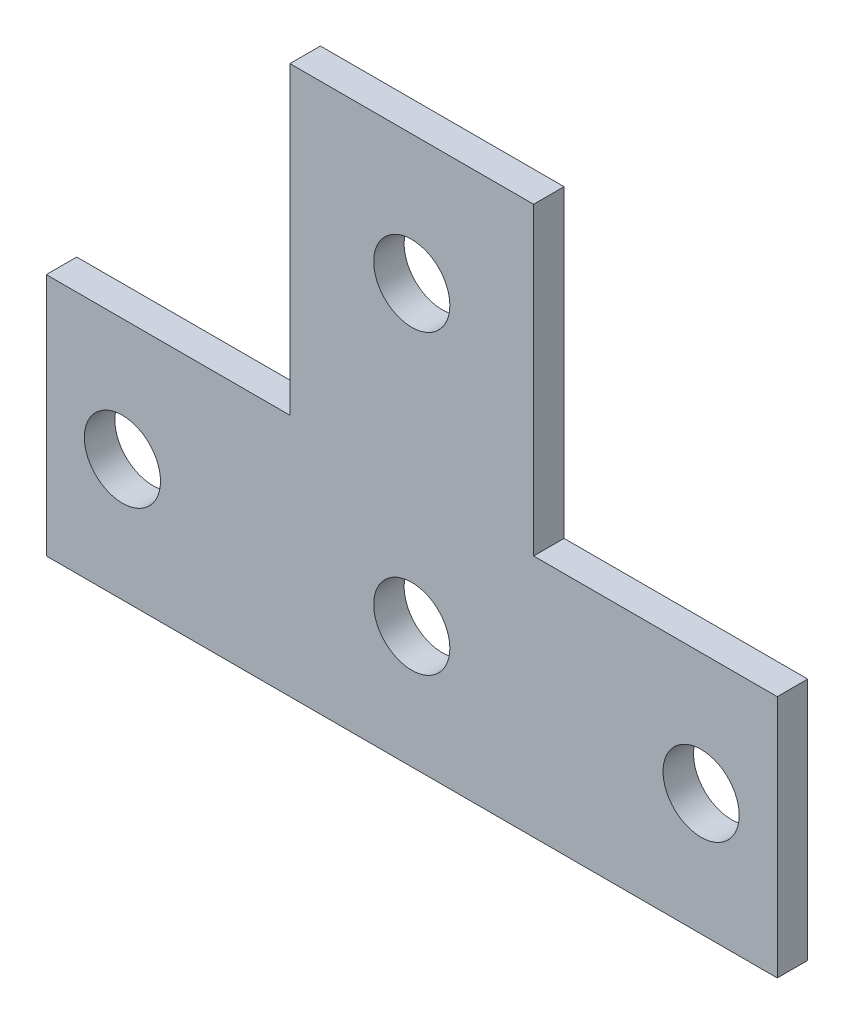
ISO-10303-21;
HEADER;
FILE_DESCRIPTION(('STEP AP214'),'2;1');
FILE_NAME('part.step','',(''),(''),'','','');
FILE_SCHEMA(('AUTOMOTIVE_DESIGN { 1 0 10303 214 1 1 1 1 }'));
ENDSEC;
DATA;
#1=APPLICATION_CONTEXT('core data for automotive mechanical design processes');
#2=APPLICATION_PROTOCOL_DEFINITION('international standard','automotive_design',2000,#1);
#3=PRODUCT_CONTEXT('',#1,'mechanical');
#4=PRODUCT('Part','Part','',(#3));
#5=PRODUCT_RELATED_PRODUCT_CATEGORY('part','',(#4));
#6=PRODUCT_DEFINITION_FORMATION('','',#4);
#7=PRODUCT_DEFINITION_CONTEXT('part definition',#1,'design');
#8=PRODUCT_DEFINITION('design','',#6,#7);
#9=PRODUCT_DEFINITION_SHAPE('','',#8);
#10=(LENGTH_UNIT() NAMED_UNIT(*) SI_UNIT(.MILLI.,.METRE.));
#11=(NAMED_UNIT(*) PLANE_ANGLE_UNIT() SI_UNIT($,.RADIAN.));
#12=(NAMED_UNIT(*) SI_UNIT($,.STERADIAN.) SOLID_ANGLE_UNIT());
#13=UNCERTAINTY_MEASURE_WITH_UNIT(LENGTH_MEASURE(1.E-05),#10,'distance_accuracy_value','');
#14=(GEOMETRIC_REPRESENTATION_CONTEXT(3) GLOBAL_UNCERTAINTY_ASSIGNED_CONTEXT((#13)) GLOBAL_UNIT_ASSIGNED_CONTEXT((#10,
#11,#12)) REPRESENTATION_CONTEXT('',''));
#15=CARTESIAN_POINT('',(0.,0.,0.));
#16=DIRECTION('',(0.,0.,1.));
#17=DIRECTION('',(1.,0.,0.));
#18=AXIS2_PLACEMENT_3D('',#15,#16,#17);
#19=CARTESIAN_POINT('',(0.,0.,2.));
#20=DIRECTION('',(0.,0.,1.));
#21=DIRECTION('',(1.,0.,0.));
#22=AXIS2_PLACEMENT_3D('',#19,#20,#21);
#23=PLANE('',#22);
#24=DIRECTION('',(1.,0.,0.));
#25=VECTOR('',#24,1.);
#26=CARTESIAN_POINT('',(-8.,20.,2.));
#27=LINE('',#26,#25);
#28=CARTESIAN_POINT('',(-8.,20.,2.));
#29=VERTEX_POINT('',#28);
#30=CARTESIAN_POINT('',(8.,20.,2.));
#31=VERTEX_POINT('',#30);
#32=EDGE_CURVE('E196',#29,#31,#27,.T.);
#33=ORIENTED_EDGE('',*,*,#32,.F.);
#34=DIRECTION('',(0.,-1.,0.));
#35=VECTOR('',#34,1.);
#36=CARTESIAN_POINT('',(-7.99999999999999,0.,2.));
#37=LINE('',#36,#35);
#38=CARTESIAN_POINT('',(-7.99999999999999,0.,2.));
#39=VERTEX_POINT('',#38);
#40=EDGE_CURVE('E67',#29,#39,#37,.T.);
#41=ORIENTED_EDGE('',*,*,#40,.T.);
#42=DIRECTION('',(-1.,0.,0.));
#43=VECTOR('',#42,1.);
#44=CARTESIAN_POINT('',(-24.,0.,2.));
#45=LINE('',#44,#43);
#46=CARTESIAN_POINT('',(-24.,0.,2.));
#47=VERTEX_POINT('',#46);
#48=EDGE_CURVE('E173',#39,#47,#45,.T.);
#49=ORIENTED_EDGE('',*,*,#48,.T.);
#50=DIRECTION('',(0.,-1.,0.));
#51=VECTOR('',#50,1.);
#52=CARTESIAN_POINT('',(-24.,-16.,2.));
#53=LINE('',#52,#51);
#54=CARTESIAN_POINT('',(-24.,-16.,2.));
#55=VERTEX_POINT('',#54);
#56=EDGE_CURVE('E102',#47,#55,#53,.T.);
#57=ORIENTED_EDGE('',*,*,#56,.T.);
#58=DIRECTION('',(1.,0.,0.));
#59=VECTOR('',#58,1.);
#60=CARTESIAN_POINT('',(24.,-16.,2.));
#61=LINE('',#60,#59);
#62=CARTESIAN_POINT('',(24.,-16.,2.));
#63=VERTEX_POINT('',#62);
#64=EDGE_CURVE('E120',#55,#63,#61,.T.);
#65=ORIENTED_EDGE('',*,*,#64,.T.);
#66=DIRECTION('',(0.,1.,0.));
#67=VECTOR('',#66,1.);
#68=CARTESIAN_POINT('',(24.,0.,2.));
#69=LINE('',#68,#67);
#70=CARTESIAN_POINT('',(24.,0.,2.));
#71=VERTEX_POINT('',#70);
#72=EDGE_CURVE('E112',#63,#71,#69,.T.);
#73=ORIENTED_EDGE('',*,*,#72,.T.);
#74=DIRECTION('',(-1.,0.,0.));
#75=VECTOR('',#74,1.);
#76=CARTESIAN_POINT('',(8.,0.,2.));
#77=LINE('',#76,#75);
#78=CARTESIAN_POINT('',(8.,0.,2.));
#79=VERTEX_POINT('',#78);
#80=EDGE_CURVE('E117',#71,#79,#77,.T.);
#81=ORIENTED_EDGE('',*,*,#80,.T.);
#82=DIRECTION('',(0.,1.,0.));
#83=VECTOR('',#82,1.);
#84=CARTESIAN_POINT('',(8.,54.,2.));
#85=LINE('',#84,#83);
#86=EDGE_CURVE('E141',#79,#31,#85,.T.);
#87=ORIENTED_EDGE('',*,*,#86,.T.);
#88=EDGE_LOOP('',(#33,#41,#49,#57,#65,#73,#81,#87));
#89=FACE_BOUND('',#88,.T.);
#90=CARTESIAN_POINT('',(0.,-8.,2.));
#91=DIRECTION('',(0.,0.,1.));
#92=DIRECTION('',(1.,0.,0.));
#93=AXIS2_PLACEMENT_3D('',#90,#91,#92);
#94=CIRCLE('',#93,2.5);
#95=CARTESIAN_POINT('',(2.50000000000001,-8.,2.));
#96=VERTEX_POINT('',#95);
#97=EDGE_CURVE('E225',#96,#96,#94,.T.);
#98=ORIENTED_EDGE('',*,*,#97,.F.);
#99=EDGE_LOOP('',(#98));
#100=FACE_BOUND('',#99,.T.);
#101=CARTESIAN_POINT('',(19.,-7.99999999999999,2.));
#102=DIRECTION('',(0.,0.,1.));
#103=DIRECTION('',(1.,0.,0.));
#104=AXIS2_PLACEMENT_3D('',#101,#102,#103);
#105=CIRCLE('',#104,2.5);
#106=CARTESIAN_POINT('',(21.5,-7.99999999999999,2.));
#107=VERTEX_POINT('',#106);
#108=EDGE_CURVE('E156',#107,#107,#105,.T.);
#109=ORIENTED_EDGE('',*,*,#108,.F.);
#110=EDGE_LOOP('',(#109));
#111=FACE_BOUND('',#110,.T.);
#112=CARTESIAN_POINT('',(-19.,-8.,2.));
#113=DIRECTION('',(0.,0.,1.));
#114=DIRECTION('',(1.,0.,0.));
#115=AXIS2_PLACEMENT_3D('',#112,#113,#114);
#116=CIRCLE('',#115,2.5);
#117=CARTESIAN_POINT('',(-16.5,-8.,2.));
#118=VERTEX_POINT('',#117);
#119=EDGE_CURVE('E217',#118,#118,#116,.T.);
#120=ORIENTED_EDGE('',*,*,#119,.F.);
#121=EDGE_LOOP('',(#120));
#122=FACE_BOUND('',#121,.T.);
#123=CARTESIAN_POINT('',(0.,11.5,2.));
#124=DIRECTION('',(0.,0.,1.));
#125=DIRECTION('',(1.,0.,0.));
#126=AXIS2_PLACEMENT_3D('',#123,#124,#125);
#127=CIRCLE('',#126,2.5);
#128=CARTESIAN_POINT('',(2.50000000000001,11.5,2.));
#129=VERTEX_POINT('',#128);
#130=EDGE_CURVE('E209',#129,#129,#127,.T.);
#131=ORIENTED_EDGE('',*,*,#130,.F.);
#132=EDGE_LOOP('',(#131));
#133=FACE_BOUND('',#132,.T.);
#134=ADVANCED_FACE('F42',(#89,#100,#111,#122,#133),#23,.T.);
#135=CARTESIAN_POINT('',(0.,0.,0.));
#136=DIRECTION('',(0.,0.,1.));
#137=DIRECTION('',(1.,0.,0.));
#138=AXIS2_PLACEMENT_3D('',#135,#136,#137);
#139=PLANE('',#138);
#140=DIRECTION('',(0.,-1.,0.));
#141=VECTOR('',#140,1.);
#142=CARTESIAN_POINT('',(-7.99999999999999,0.,0.));
#143=LINE('',#142,#141);
#144=CARTESIAN_POINT('',(-7.99999999999999,20.,0.));
#145=VERTEX_POINT('',#144);
#146=CARTESIAN_POINT('',(-7.99999999999999,0.,0.));
#147=VERTEX_POINT('',#146);
#148=EDGE_CURVE('E94',#145,#147,#143,.T.);
#149=ORIENTED_EDGE('',*,*,#148,.F.);
#150=DIRECTION('',(1.,0.,0.));
#151=VECTOR('',#150,1.);
#152=CARTESIAN_POINT('',(-8.,20.,0.));
#153=LINE('',#152,#151);
#154=CARTESIAN_POINT('',(8.,20.,0.));
#155=VERTEX_POINT('',#154);
#156=EDGE_CURVE('E58',#145,#155,#153,.T.);
#157=ORIENTED_EDGE('',*,*,#156,.T.);
#158=DIRECTION('',(0.,1.,0.));
#159=VECTOR('',#158,1.);
#160=CARTESIAN_POINT('',(8.,54.,0.));
#161=LINE('',#160,#159);
#162=CARTESIAN_POINT('',(8.,0.,0.));
#163=VERTEX_POINT('',#162);
#164=EDGE_CURVE('E167',#163,#155,#161,.T.);
#165=ORIENTED_EDGE('',*,*,#164,.F.);
#166=DIRECTION('',(-1.,0.,0.));
#167=VECTOR('',#166,1.);
#168=CARTESIAN_POINT('',(8.,0.,0.));
#169=LINE('',#168,#167);
#170=CARTESIAN_POINT('',(24.,0.,0.));
#171=VERTEX_POINT('',#170);
#172=EDGE_CURVE('E164',#171,#163,#169,.T.);
#173=ORIENTED_EDGE('',*,*,#172,.F.);
#174=DIRECTION('',(0.,1.,0.));
#175=VECTOR('',#174,1.);
#176=CARTESIAN_POINT('',(24.,0.,0.));
#177=LINE('',#176,#175);
#178=CARTESIAN_POINT('',(24.,-16.,0.));
#179=VERTEX_POINT('',#178);
#180=EDGE_CURVE('E130',#179,#171,#177,.T.);
#181=ORIENTED_EDGE('',*,*,#180,.F.);
#182=DIRECTION('',(1.,0.,0.));
#183=VECTOR('',#182,1.);
#184=CARTESIAN_POINT('',(24.,-16.,0.));
#185=LINE('',#184,#183);
#186=CARTESIAN_POINT('',(-24.,-16.,0.));
#187=VERTEX_POINT('',#186);
#188=EDGE_CURVE('E159',#187,#179,#185,.T.);
#189=ORIENTED_EDGE('',*,*,#188,.F.);
#190=DIRECTION('',(0.,-1.,0.));
#191=VECTOR('',#190,1.);
#192=CARTESIAN_POINT('',(-24.,-16.,0.));
#193=LINE('',#192,#191);
#194=CARTESIAN_POINT('',(-24.,0.,0.));
#195=VERTEX_POINT('',#194);
#196=EDGE_CURVE('E155',#195,#187,#193,.T.);
#197=ORIENTED_EDGE('',*,*,#196,.F.);
#198=DIRECTION('',(-1.,0.,0.));
#199=VECTOR('',#198,1.);
#200=CARTESIAN_POINT('',(-24.,0.,0.));
#201=LINE('',#200,#199);
#202=EDGE_CURVE('E151',#147,#195,#201,.T.);
#203=ORIENTED_EDGE('',*,*,#202,.F.);
#204=EDGE_LOOP('',(#149,#157,#165,#173,#181,#189,#197,#203));
#205=FACE_BOUND('',#204,.T.);
#206=CARTESIAN_POINT('',(19.,-7.99999999999999,0.));
#207=DIRECTION('',(0.,0.,1.));
#208=DIRECTION('',(1.,0.,0.));
#209=AXIS2_PLACEMENT_3D('',#206,#207,#208);
#210=CIRCLE('',#209,2.5);
#211=CARTESIAN_POINT('',(21.5,-7.99999999999999,0.));
#212=VERTEX_POINT('',#211);
#213=EDGE_CURVE('E229',#212,#212,#210,.T.);
#214=ORIENTED_EDGE('',*,*,#213,.T.);
#215=EDGE_LOOP('',(#214));
#216=FACE_BOUND('',#215,.T.);
#217=CARTESIAN_POINT('',(0.,-8.,0.));
#218=DIRECTION('',(0.,0.,1.));
#219=DIRECTION('',(1.,0.,0.));
#220=AXIS2_PLACEMENT_3D('',#217,#218,#219);
#221=CIRCLE('',#220,2.5);
#222=CARTESIAN_POINT('',(2.50000000000001,-8.,0.));
#223=VERTEX_POINT('',#222);
#224=EDGE_CURVE('E221',#223,#223,#221,.T.);
#225=ORIENTED_EDGE('',*,*,#224,.T.);
#226=EDGE_LOOP('',(#225));
#227=FACE_BOUND('',#226,.T.);
#228=CARTESIAN_POINT('',(-19.,-8.,0.));
#229=DIRECTION('',(0.,0.,1.));
#230=DIRECTION('',(1.,0.,0.));
#231=AXIS2_PLACEMENT_3D('',#228,#229,#230);
#232=CIRCLE('',#231,2.5);
#233=CARTESIAN_POINT('',(-16.5,-8.,0.));
#234=VERTEX_POINT('',#233);
#235=EDGE_CURVE('E213',#234,#234,#232,.T.);
#236=ORIENTED_EDGE('',*,*,#235,.T.);
#237=EDGE_LOOP('',(#236));
#238=FACE_BOUND('',#237,.T.);
#239=CARTESIAN_POINT('',(0.,11.5,0.));
#240=DIRECTION('',(0.,0.,1.));
#241=DIRECTION('',(1.,0.,0.));
#242=AXIS2_PLACEMENT_3D('',#239,#240,#241);
#243=CIRCLE('',#242,2.5);
#244=CARTESIAN_POINT('',(2.50000000000001,11.5,0.));
#245=VERTEX_POINT('',#244);
#246=EDGE_CURVE('E204',#245,#245,#243,.T.);
#247=ORIENTED_EDGE('',*,*,#246,.T.);
#248=EDGE_LOOP('',(#247));
#249=FACE_BOUND('',#248,.T.);
#250=ADVANCED_FACE('F186',(#205,#216,#227,#238,#249),#139,.F.);
#251=CARTESIAN_POINT('',(-24.,0.,2.));
#252=DIRECTION('',(0.,-1.,0.));
#253=DIRECTION('',(0.,0.,-1.));
#254=AXIS2_PLACEMENT_3D('',#251,#252,#253);
#255=PLANE('',#254);
#256=ORIENTED_EDGE('',*,*,#202,.T.);
#257=DIRECTION('',(0.,0.,-1.));
#258=VECTOR('',#257,1.);
#259=CARTESIAN_POINT('',(-24.,0.,2.));
#260=LINE('',#259,#258);
#261=EDGE_CURVE('E11',#47,#195,#260,.T.);
#262=ORIENTED_EDGE('',*,*,#261,.F.);
#263=ORIENTED_EDGE('',*,*,#48,.F.);
#264=DIRECTION('',(0.,0.,-1.));
#265=VECTOR('',#264,1.);
#266=CARTESIAN_POINT('',(-7.99999999999999,0.,2.));
#267=LINE('',#266,#265);
#268=EDGE_CURVE('E150',#39,#147,#267,.T.);
#269=ORIENTED_EDGE('',*,*,#268,.T.);
#270=EDGE_LOOP('',(#256,#262,#263,#269));
#271=FACE_BOUND('',#270,.T.);
#272=ADVANCED_FACE('F44',(#271),#255,.F.);
#273=CARTESIAN_POINT('',(-24.,-16.,2.));
#274=DIRECTION('',(1.,0.,0.));
#275=DIRECTION('',(0.,0.,-1.));
#276=AXIS2_PLACEMENT_3D('',#273,#274,#275);
#277=PLANE('',#276);
#278=ORIENTED_EDGE('',*,*,#196,.T.);
#279=DIRECTION('',(0.,0.,-1.));
#280=VECTOR('',#279,1.);
#281=CARTESIAN_POINT('',(-24.,-16.,2.));
#282=LINE('',#281,#280);
#283=EDGE_CURVE('E51',#55,#187,#282,.T.);
#284=ORIENTED_EDGE('',*,*,#283,.F.);
#285=ORIENTED_EDGE('',*,*,#56,.F.);
#286=ORIENTED_EDGE('',*,*,#261,.T.);
#287=EDGE_LOOP('',(#278,#284,#285,#286));
#288=FACE_BOUND('',#287,.T.);
#289=ADVANCED_FACE('F272',(#288),#277,.F.);
#290=CARTESIAN_POINT('',(24.,-16.,2.));
#291=DIRECTION('',(0.,1.,0.));
#292=DIRECTION('',(-1.,0.,0.));
#293=AXIS2_PLACEMENT_3D('',#290,#291,#292);
#294=PLANE('',#293);
#295=ORIENTED_EDGE('',*,*,#188,.T.);
#296=DIRECTION('',(0.,0.,-1.));
#297=VECTOR('',#296,1.);
#298=CARTESIAN_POINT('',(24.,-16.,2.));
#299=LINE('',#298,#297);
#300=EDGE_CURVE('E134',#63,#179,#299,.T.);
#301=ORIENTED_EDGE('',*,*,#300,.F.);
#302=ORIENTED_EDGE('',*,*,#64,.F.);
#303=ORIENTED_EDGE('',*,*,#283,.T.);
#304=EDGE_LOOP('',(#295,#301,#302,#303));
#305=FACE_BOUND('',#304,.T.);
#306=ADVANCED_FACE('F184',(#305),#294,.F.);
#307=CARTESIAN_POINT('',(24.,0.,2.));
#308=DIRECTION('',(-1.,0.,0.));
#309=DIRECTION('',(0.,-1.,0.));
#310=AXIS2_PLACEMENT_3D('',#307,#308,#309);
#311=PLANE('',#310);
#312=ORIENTED_EDGE('',*,*,#180,.T.);
#313=DIRECTION('',(0.,0.,-1.));
#314=VECTOR('',#313,1.);
#315=CARTESIAN_POINT('',(24.,0.,2.));
#316=LINE('',#315,#314);
#317=EDGE_CURVE('E127',#71,#171,#316,.T.);
#318=ORIENTED_EDGE('',*,*,#317,.F.);
#319=ORIENTED_EDGE('',*,*,#72,.F.);
#320=ORIENTED_EDGE('',*,*,#300,.T.);
#321=EDGE_LOOP('',(#312,#318,#319,#320));
#322=FACE_BOUND('',#321,.T.);
#323=ADVANCED_FACE('F128',(#322),#311,.F.);
#324=CARTESIAN_POINT('',(8.,0.,2.));
#325=DIRECTION('',(0.,-1.,0.));
#326=DIRECTION('',(1.,0.,0.));
#327=AXIS2_PLACEMENT_3D('',#324,#325,#326);
#328=PLANE('',#327);
#329=ORIENTED_EDGE('',*,*,#172,.T.);
#330=DIRECTION('',(0.,0.,-1.));
#331=VECTOR('',#330,1.);
#332=CARTESIAN_POINT('',(8.,0.,2.));
#333=LINE('',#332,#331);
#334=EDGE_CURVE('E135',#79,#163,#333,.T.);
#335=ORIENTED_EDGE('',*,*,#334,.F.);
#336=ORIENTED_EDGE('',*,*,#80,.F.);
#337=ORIENTED_EDGE('',*,*,#317,.T.);
#338=EDGE_LOOP('',(#329,#335,#336,#337));
#339=FACE_BOUND('',#338,.T.);
#340=ADVANCED_FACE('F137',(#339),#328,.F.);
#341=CARTESIAN_POINT('',(8.,54.,2.));
#342=DIRECTION('',(-1.,0.,0.));
#343=DIRECTION('',(0.,-1.,0.));
#344=AXIS2_PLACEMENT_3D('',#341,#342,#343);
#345=PLANE('',#344);
#346=ORIENTED_EDGE('',*,*,#164,.T.);
#347=DIRECTION('',(0.,0.,1.));
#348=VECTOR('',#347,1.);
#349=CARTESIAN_POINT('',(8.,20.,0.));
#350=LINE('',#349,#348);
#351=EDGE_CURVE('E193',#155,#31,#350,.T.);
#352=ORIENTED_EDGE('',*,*,#351,.T.);
#353=ORIENTED_EDGE('',*,*,#86,.F.);
#354=ORIENTED_EDGE('',*,*,#334,.T.);
#355=EDGE_LOOP('',(#346,#352,#353,#354));
#356=FACE_BOUND('',#355,.T.);
#357=ADVANCED_FACE('F191',(#356),#345,.F.);
#358=CARTESIAN_POINT('',(-7.99999999999999,0.,2.));
#359=DIRECTION('',(1.,0.,0.));
#360=DIRECTION('',(0.,1.,0.));
#361=AXIS2_PLACEMENT_3D('',#358,#359,#360);
#362=PLANE('',#361);
#363=ORIENTED_EDGE('',*,*,#40,.F.);
#364=DIRECTION('',(0.,0.,1.));
#365=VECTOR('',#364,1.);
#366=CARTESIAN_POINT('',(-8.,20.,0.));
#367=LINE('',#366,#365);
#368=EDGE_CURVE('E198',#145,#29,#367,.T.);
#369=ORIENTED_EDGE('',*,*,#368,.F.);
#370=ORIENTED_EDGE('',*,*,#148,.T.);
#371=ORIENTED_EDGE('',*,*,#268,.F.);
#372=EDGE_LOOP('',(#363,#369,#370,#371));
#373=FACE_BOUND('',#372,.T.);
#374=ADVANCED_FACE('F289',(#373),#362,.F.);
#375=CARTESIAN_POINT('',(19.,-7.99999999999999,2.));
#376=DIRECTION('',(0.,0.,-1.));
#377=DIRECTION('',(-1.,0.,0.));
#378=AXIS2_PLACEMENT_3D('',#375,#376,#377);
#379=CYLINDRICAL_SURFACE('',#378,2.5);
#380=ORIENTED_EDGE('',*,*,#108,.T.);
#381=EDGE_LOOP('',(#380));
#382=FACE_BOUND('',#381,.T.);
#383=ORIENTED_EDGE('',*,*,#213,.F.);
#384=EDGE_LOOP('',(#383));
#385=FACE_BOUND('',#384,.T.);
#386=ADVANCED_FACE('F286',(#382,#385),#379,.F.);
#387=CARTESIAN_POINT('',(0.,-8.,2.));
#388=DIRECTION('',(0.,0.,-1.));
#389=DIRECTION('',(-1.,0.,0.));
#390=AXIS2_PLACEMENT_3D('',#387,#388,#389);
#391=CYLINDRICAL_SURFACE('',#390,2.5);
#392=ORIENTED_EDGE('',*,*,#97,.T.);
#393=EDGE_LOOP('',(#392));
#394=FACE_BOUND('',#393,.T.);
#395=ORIENTED_EDGE('',*,*,#224,.F.);
#396=EDGE_LOOP('',(#395));
#397=FACE_BOUND('',#396,.T.);
#398=ADVANCED_FACE('F319',(#394,#397),#391,.F.);
#399=CARTESIAN_POINT('',(-19.,-8.,2.));
#400=DIRECTION('',(0.,0.,-1.));
#401=DIRECTION('',(-1.,0.,0.));
#402=AXIS2_PLACEMENT_3D('',#399,#400,#401);
#403=CYLINDRICAL_SURFACE('',#402,2.5);
#404=ORIENTED_EDGE('',*,*,#119,.T.);
#405=EDGE_LOOP('',(#404));
#406=FACE_BOUND('',#405,.T.);
#407=ORIENTED_EDGE('',*,*,#235,.F.);
#408=EDGE_LOOP('',(#407));
#409=FACE_BOUND('',#408,.T.);
#410=ADVANCED_FACE('F325',(#406,#409),#403,.F.);
#411=CARTESIAN_POINT('',(0.,11.5,2.));
#412=DIRECTION('',(0.,0.,-1.));
#413=DIRECTION('',(-1.,0.,0.));
#414=AXIS2_PLACEMENT_3D('',#411,#412,#413);
#415=CYLINDRICAL_SURFACE('',#414,2.5);
#416=ORIENTED_EDGE('',*,*,#130,.T.);
#417=EDGE_LOOP('',(#416));
#418=FACE_BOUND('',#417,.T.);
#419=ORIENTED_EDGE('',*,*,#246,.F.);
#420=EDGE_LOOP('',(#419));
#421=FACE_BOUND('',#420,.T.);
#422=ADVANCED_FACE('F331',(#418,#421),#415,.F.);
#423=CARTESIAN_POINT('',(-8.,20.,0.));
#424=DIRECTION('',(0.,-1.,0.));
#425=DIRECTION('',(1.,0.,0.));
#426=AXIS2_PLACEMENT_3D('',#423,#424,#425);
#427=PLANE('',#426);
#428=ORIENTED_EDGE('',*,*,#32,.T.);
#429=ORIENTED_EDGE('',*,*,#351,.F.);
#430=ORIENTED_EDGE('',*,*,#156,.F.);
#431=ORIENTED_EDGE('',*,*,#368,.T.);
#432=EDGE_LOOP('',(#428,#429,#430,#431));
#433=FACE_BOUND('',#432,.T.);
#434=ADVANCED_FACE('F199',(#433),#427,.F.);
#435=CLOSED_SHELL('',(#134,#250,#272,#289,#306,#323,#340,#357,#374,#386,#398,#410,#422,#434));
#436=MANIFOLD_SOLID_BREP('B2',#435);
#437=ADVANCED_BREP_SHAPE_REPRESENTATION('',(#18,#436),#14);
#438=SHAPE_DEFINITION_REPRESENTATION(#9,#437);
ENDSEC;
END-ISO-10303-21;
